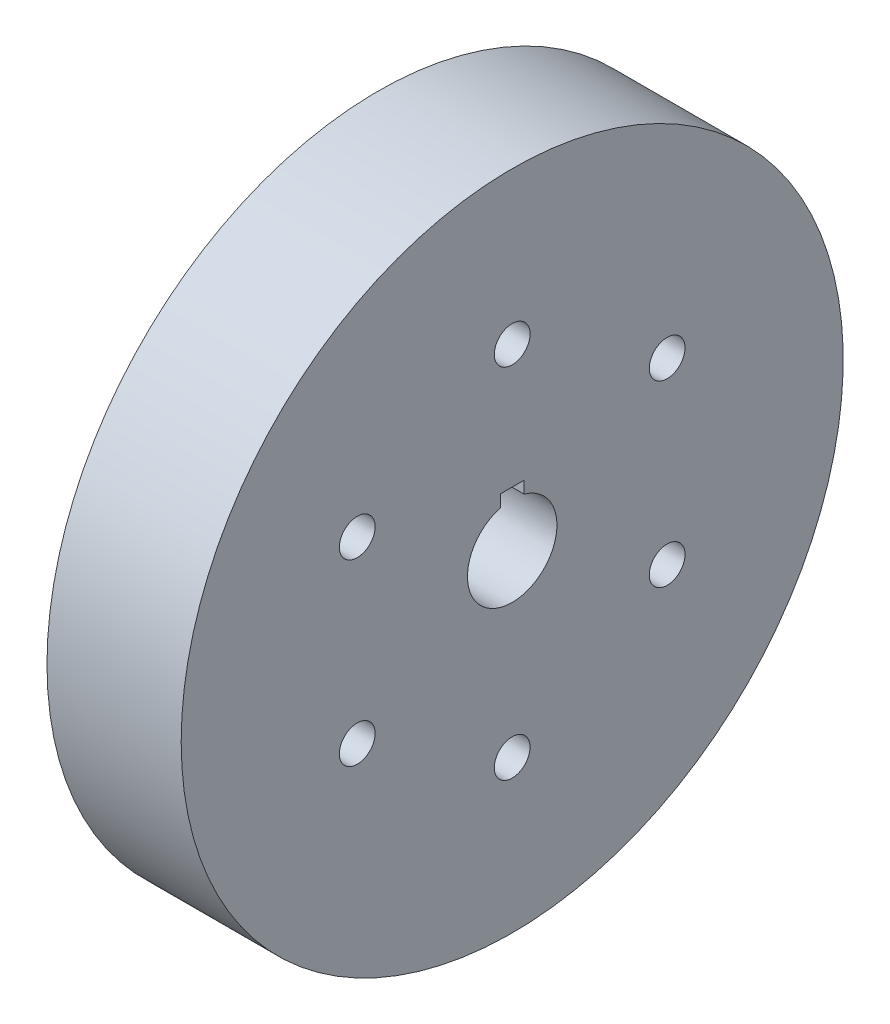
ISO-10303-21;
HEADER;
FILE_DESCRIPTION(('STEP AP214'),'2;1');
FILE_NAME('part.step','',(''),(''),'','','');
FILE_SCHEMA(('AUTOMOTIVE_DESIGN { 1 0 10303 214 1 1 1 1 }'));
ENDSEC;
DATA;
#1=APPLICATION_CONTEXT('core data for automotive mechanical design processes');
#2=APPLICATION_PROTOCOL_DEFINITION('international standard','automotive_design',2000,#1);
#3=PRODUCT_CONTEXT('',#1,'mechanical');
#4=PRODUCT('Part','Part','',(#3));
#5=PRODUCT_RELATED_PRODUCT_CATEGORY('part','',(#4));
#6=PRODUCT_DEFINITION_FORMATION('','',#4);
#7=PRODUCT_DEFINITION_CONTEXT('part definition',#1,'design');
#8=PRODUCT_DEFINITION('design','',#6,#7);
#9=PRODUCT_DEFINITION_SHAPE('','',#8);
#10=(LENGTH_UNIT() NAMED_UNIT(*) SI_UNIT(.MILLI.,.METRE.));
#11=(NAMED_UNIT(*) PLANE_ANGLE_UNIT() SI_UNIT($,.RADIAN.));
#12=(NAMED_UNIT(*) SI_UNIT($,.STERADIAN.) SOLID_ANGLE_UNIT());
#13=UNCERTAINTY_MEASURE_WITH_UNIT(LENGTH_MEASURE(1.E-05),#10,'distance_accuracy_value','');
#14=(GEOMETRIC_REPRESENTATION_CONTEXT(3) GLOBAL_UNCERTAINTY_ASSIGNED_CONTEXT((#13)) GLOBAL_UNIT_ASSIGNED_CONTEXT((#10,
#11,#12)) REPRESENTATION_CONTEXT('',''));
#15=CARTESIAN_POINT('',(0.,0.,0.));
#16=DIRECTION('',(0.,0.,1.));
#17=DIRECTION('',(1.,0.,0.));
#18=AXIS2_PLACEMENT_3D('',#15,#16,#17);
#19=CARTESIAN_POINT('',(0.,0.,0.));
#20=DIRECTION('',(-1.,0.,0.));
#21=DIRECTION('',(0.,0.,1.));
#22=AXIS2_PLACEMENT_3D('',#19,#20,#21);
#23=CYLINDRICAL_SURFACE('',#22,111.);
#24=CARTESIAN_POINT('',(-45.,0.,0.));
#25=DIRECTION('',(-1.,0.,0.));
#26=DIRECTION('',(0.,0.,1.));
#27=AXIS2_PLACEMENT_3D('',#24,#25,#26);
#28=CIRCLE('',#27,111.);
#29=CARTESIAN_POINT('',(-45.,0.,111.));
#30=VERTEX_POINT('',#29);
#31=EDGE_CURVE('E122',#30,#30,#28,.T.);
#32=ORIENTED_EDGE('',*,*,#31,.F.);
#33=EDGE_LOOP('',(#32));
#34=FACE_BOUND('',#33,.T.);
#35=CARTESIAN_POINT('',(0.,0.,0.));
#36=DIRECTION('',(-1.,0.,0.));
#37=DIRECTION('',(0.,0.,1.));
#38=AXIS2_PLACEMENT_3D('',#35,#36,#37);
#39=CIRCLE('',#38,111.);
#40=CARTESIAN_POINT('',(0.,0.,111.));
#41=VERTEX_POINT('',#40);
#42=EDGE_CURVE('E95',#41,#41,#39,.T.);
#43=ORIENTED_EDGE('',*,*,#42,.T.);
#44=EDGE_LOOP('',(#43));
#45=FACE_BOUND('',#44,.T.);
#46=ADVANCED_FACE('F36',(#34,#45),#23,.T.);
#47=CARTESIAN_POINT('',(-45.,0.,-111.));
#48=DIRECTION('',(1.,0.,0.));
#49=DIRECTION('',(0.,0.,-1.));
#50=AXIS2_PLACEMENT_3D('',#47,#48,#49);
#51=PLANE('',#50);
#52=CARTESIAN_POINT('',(-45.,0.,0.));
#53=DIRECTION('',(-1.,0.,0.));
#54=DIRECTION('',(0.,0.,1.));
#55=AXIS2_PLACEMENT_3D('',#52,#53,#54);
#56=CIRCLE('',#55,96.);
#57=CARTESIAN_POINT('',(-45.,0.,96.));
#58=VERTEX_POINT('',#57);
#59=EDGE_CURVE('E119',#58,#58,#56,.T.);
#60=ORIENTED_EDGE('',*,*,#59,.F.);
#61=EDGE_LOOP('',(#60));
#62=FACE_BOUND('',#61,.T.);
#63=ORIENTED_EDGE('',*,*,#31,.T.);
#64=EDGE_LOOP('',(#63));
#65=FACE_BOUND('',#64,.T.);
#66=ADVANCED_FACE('F149',(#62,#65),#51,.F.);
#67=CARTESIAN_POINT('',(0.,0.,0.));
#68=DIRECTION('',(-1.,0.,0.));
#69=DIRECTION('',(0.,0.,1.));
#70=AXIS2_PLACEMENT_3D('',#67,#68,#69);
#71=CYLINDRICAL_SURFACE('',#70,96.);
#72=CARTESIAN_POINT('',(-40.,0.,0.));
#73=DIRECTION('',(-1.,0.,0.));
#74=DIRECTION('',(0.,0.,1.));
#75=AXIS2_PLACEMENT_3D('',#72,#73,#74);
#76=CIRCLE('',#75,96.);
#77=CARTESIAN_POINT('',(-40.,0.,96.));
#78=VERTEX_POINT('',#77);
#79=EDGE_CURVE('E116',#78,#78,#76,.T.);
#80=ORIENTED_EDGE('',*,*,#79,.F.);
#81=EDGE_LOOP('',(#80));
#82=FACE_BOUND('',#81,.T.);
#83=ORIENTED_EDGE('',*,*,#59,.T.);
#84=EDGE_LOOP('',(#83));
#85=FACE_BOUND('',#84,.T.);
#86=ADVANCED_FACE('F154',(#82,#85),#71,.F.);
#87=CARTESIAN_POINT('',(-40.,0.,0.));
#88=DIRECTION('',(-1.,0.,0.));
#89=DIRECTION('',(0.,0.,1.));
#90=AXIS2_PLACEMENT_3D('',#87,#88,#89);
#91=TOROIDAL_SURFACE('',#90,91.,5.);
#92=CARTESIAN_POINT('',(-35.,0.,0.));
#93=DIRECTION('',(-1.,0.,0.));
#94=DIRECTION('',(0.,0.,1.));
#95=AXIS2_PLACEMENT_3D('',#92,#93,#94);
#96=CIRCLE('',#95,91.);
#97=CARTESIAN_POINT('',(-35.,0.,91.));
#98=VERTEX_POINT('',#97);
#99=EDGE_CURVE('E113',#98,#98,#96,.T.);
#100=ORIENTED_EDGE('',*,*,#99,.F.);
#101=EDGE_LOOP('',(#100));
#102=FACE_BOUND('',#101,.T.);
#103=ORIENTED_EDGE('',*,*,#79,.T.);
#104=EDGE_LOOP('',(#103));
#105=FACE_BOUND('',#104,.T.);
#106=ADVANCED_FACE('F164',(#102,#105),#91,.F.);
#107=CARTESIAN_POINT('',(-35.,0.,-91.));
#108=DIRECTION('',(1.,0.,0.));
#109=DIRECTION('',(0.,0.,-1.));
#110=AXIS2_PLACEMENT_3D('',#107,#108,#109);
#111=PLANE('',#110);
#112=CARTESIAN_POINT('',(-35.,-60.,0.));
#113=DIRECTION('',(-1.,0.,0.));
#114=DIRECTION('',(0.,0.,-1.));
#115=AXIS2_PLACEMENT_3D('',#112,#113,#114);
#116=CIRCLE('',#115,6.);
#117=CARTESIAN_POINT('',(-35.,-60.,-6.));
#118=VERTEX_POINT('',#117);
#119=EDGE_CURVE('E313',#118,#118,#116,.T.);
#120=ORIENTED_EDGE('',*,*,#119,.F.);
#121=EDGE_LOOP('',(#120));
#122=FACE_BOUND('',#121,.T.);
#123=CARTESIAN_POINT('',(-35.,29.9999999999994,-51.9615242270666));
#124=DIRECTION('',(-1.,0.,0.));
#125=DIRECTION('',(0.,0.,-1.));
#126=AXIS2_PLACEMENT_3D('',#123,#124,#125);
#127=CIRCLE('',#126,6.00000000000001);
#128=CARTESIAN_POINT('',(-35.,29.9999999999994,-57.9615242270666));
#129=VERTEX_POINT('',#128);
#130=EDGE_CURVE('E327',#129,#129,#127,.T.);
#131=ORIENTED_EDGE('',*,*,#130,.F.);
#132=EDGE_LOOP('',(#131));
#133=FACE_BOUND('',#132,.T.);
#134=CARTESIAN_POINT('',(-35.,-29.9999999999999,51.9615242270664));
#135=DIRECTION('',(-1.,0.,0.));
#136=DIRECTION('',(0.,0.,-1.));
#137=AXIS2_PLACEMENT_3D('',#134,#135,#136);
#138=CIRCLE('',#137,6.);
#139=CARTESIAN_POINT('',(-35.,-29.9999999999999,45.9615242270664));
#140=VERTEX_POINT('',#139);
#141=EDGE_CURVE('E338',#140,#140,#138,.T.);
#142=ORIENTED_EDGE('',*,*,#141,.F.);
#143=EDGE_LOOP('',(#142));
#144=FACE_BOUND('',#143,.T.);
#145=CARTESIAN_POINT('',(-35.,-29.9999999999994,-51.9615242270666));
#146=DIRECTION('',(-1.,0.,0.));
#147=DIRECTION('',(0.,0.,1.));
#148=AXIS2_PLACEMENT_3D('',#145,#146,#147);
#149=CIRCLE('',#148,6.00000000000001);
#150=CARTESIAN_POINT('',(-35.,-29.9999999999994,-45.9615242270666));
#151=VERTEX_POINT('',#150);
#152=EDGE_CURVE('E344',#151,#151,#149,.T.);
#153=ORIENTED_EDGE('',*,*,#152,.F.);
#154=EDGE_LOOP('',(#153));
#155=FACE_BOUND('',#154,.T.);
#156=CARTESIAN_POINT('',(-35.,60.,0.));
#157=DIRECTION('',(-1.,0.,0.));
#158=DIRECTION('',(0.,0.,1.));
#159=AXIS2_PLACEMENT_3D('',#156,#157,#158);
#160=CIRCLE('',#159,6.);
#161=CARTESIAN_POINT('',(-35.,60.,6.));
#162=VERTEX_POINT('',#161);
#163=EDGE_CURVE('E315',#162,#162,#160,.T.);
#164=ORIENTED_EDGE('',*,*,#163,.F.);
#165=EDGE_LOOP('',(#164));
#166=FACE_BOUND('',#165,.T.);
#167=CARTESIAN_POINT('',(-35.,29.9999999999999,51.9615242270664));
#168=DIRECTION('',(-1.,0.,0.));
#169=DIRECTION('',(0.,0.,1.));
#170=AXIS2_PLACEMENT_3D('',#167,#168,#169);
#171=CIRCLE('',#170,6.);
#172=CARTESIAN_POINT('',(-35.,29.9999999999999,57.9615242270664));
#173=VERTEX_POINT('',#172);
#174=EDGE_CURVE('E321',#173,#173,#171,.T.);
#175=ORIENTED_EDGE('',*,*,#174,.F.);
#176=EDGE_LOOP('',(#175));
#177=FACE_BOUND('',#176,.T.);
#178=CARTESIAN_POINT('',(-35.,0.,0.));
#179=DIRECTION('',(-1.,0.,0.));
#180=DIRECTION('',(0.,0.,1.));
#181=AXIS2_PLACEMENT_3D('',#178,#179,#180);
#182=CIRCLE('',#181,35.);
#183=CARTESIAN_POINT('',(-35.,0.,35.));
#184=VERTEX_POINT('',#183);
#185=EDGE_CURVE('E110',#184,#184,#182,.T.);
#186=ORIENTED_EDGE('',*,*,#185,.F.);
#187=EDGE_LOOP('',(#186));
#188=FACE_BOUND('',#187,.T.);
#189=ORIENTED_EDGE('',*,*,#99,.T.);
#190=EDGE_LOOP('',(#189));
#191=FACE_BOUND('',#190,.T.);
#192=ADVANCED_FACE('F171',(#122,#133,#144,#155,#166,#177,#188,#191),#111,.F.);
#193=CARTESIAN_POINT('',(-40.,0.,0.));
#194=DIRECTION('',(-1.,0.,0.));
#195=DIRECTION('',(0.,0.,1.));
#196=AXIS2_PLACEMENT_3D('',#193,#194,#195);
#197=TOROIDAL_SURFACE('',#196,35.,5.);
#198=CARTESIAN_POINT('',(-40.,0.,0.));
#199=DIRECTION('',(-1.,0.,0.));
#200=DIRECTION('',(0.,0.,1.));
#201=AXIS2_PLACEMENT_3D('',#198,#199,#200);
#202=CIRCLE('',#201,30.);
#203=CARTESIAN_POINT('',(-40.,0.,30.));
#204=VERTEX_POINT('',#203);
#205=EDGE_CURVE('E107',#204,#204,#202,.T.);
#206=ORIENTED_EDGE('',*,*,#205,.F.);
#207=EDGE_LOOP('',(#206));
#208=FACE_BOUND('',#207,.T.);
#209=ORIENTED_EDGE('',*,*,#185,.T.);
#210=EDGE_LOOP('',(#209));
#211=FACE_BOUND('',#210,.T.);
#212=ADVANCED_FACE('F175',(#208,#211),#197,.F.);
#213=CARTESIAN_POINT('',(0.,0.,0.));
#214=DIRECTION('',(-1.,0.,0.));
#215=DIRECTION('',(0.,0.,1.));
#216=AXIS2_PLACEMENT_3D('',#213,#214,#215);
#217=CYLINDRICAL_SURFACE('',#216,30.);
#218=CARTESIAN_POINT('',(-70.,0.,0.));
#219=DIRECTION('',(-1.,0.,0.));
#220=DIRECTION('',(0.,0.,1.));
#221=AXIS2_PLACEMENT_3D('',#218,#219,#220);
#222=CIRCLE('',#221,30.);
#223=CARTESIAN_POINT('',(-70.,0.,30.));
#224=VERTEX_POINT('',#223);
#225=EDGE_CURVE('E98',#224,#224,#222,.T.);
#226=ORIENTED_EDGE('',*,*,#225,.F.);
#227=EDGE_LOOP('',(#226));
#228=FACE_BOUND('',#227,.T.);
#229=ORIENTED_EDGE('',*,*,#205,.T.);
#230=EDGE_LOOP('',(#229));
#231=FACE_BOUND('',#230,.T.);
#232=ADVANCED_FACE('F146',(#228,#231),#217,.T.);
#233=CARTESIAN_POINT('',(-70.,0.,-30.));
#234=DIRECTION('',(1.,0.,0.));
#235=DIRECTION('',(0.,0.,-1.));
#236=AXIS2_PLACEMENT_3D('',#233,#234,#235);
#237=PLANE('',#236);
#238=DIRECTION('',(0.,0.,1.));
#239=VECTOR('',#238,1.);
#240=CARTESIAN_POINT('',(-70.,18.5,-3.99999999999999));
#241=LINE('',#240,#239);
#242=CARTESIAN_POINT('',(-70.,18.5,-3.99999999999999));
#243=VERTEX_POINT('',#242);
#244=CARTESIAN_POINT('',(-70.,18.5,4.00000000000001));
#245=VERTEX_POINT('',#244);
#246=EDGE_CURVE('E127',#243,#245,#241,.T.);
#247=ORIENTED_EDGE('',*,*,#246,.T.);
#248=DIRECTION('',(0.,1.,0.));
#249=VECTOR('',#248,1.);
#250=CARTESIAN_POINT('',(-70.,11.5,4.00000000000001));
#251=LINE('',#250,#249);
#252=CARTESIAN_POINT('',(-70.,14.456832294801,4.00000000000001));
#253=VERTEX_POINT('',#252);
#254=EDGE_CURVE('E87',#253,#245,#251,.T.);
#255=ORIENTED_EDGE('',*,*,#254,.F.);
#256=CARTESIAN_POINT('',(-70.,0.,0.));
#257=DIRECTION('',(-1.,0.,0.));
#258=DIRECTION('',(0.,0.,1.));
#259=AXIS2_PLACEMENT_3D('',#256,#257,#258);
#260=CIRCLE('',#259,15.);
#261=CARTESIAN_POINT('',(-70.,14.456832294801,-3.99999999999999));
#262=VERTEX_POINT('',#261);
#263=EDGE_CURVE('E94',#262,#253,#260,.T.);
#264=ORIENTED_EDGE('',*,*,#263,.F.);
#265=DIRECTION('',(0.,1.,0.));
#266=VECTOR('',#265,1.);
#267=CARTESIAN_POINT('',(-70.,11.5,-3.99999999999999));
#268=LINE('',#267,#266);
#269=EDGE_CURVE('E83',#262,#243,#268,.T.);
#270=ORIENTED_EDGE('',*,*,#269,.T.);
#271=EDGE_LOOP('',(#247,#255,#264,#270));
#272=FACE_BOUND('',#271,.T.);
#273=ORIENTED_EDGE('',*,*,#225,.T.);
#274=EDGE_LOOP('',(#273));
#275=FACE_BOUND('',#274,.T.);
#276=ADVANCED_FACE('F132',(#272,#275),#237,.F.);
#277=CARTESIAN_POINT('',(0.,0.,0.));
#278=DIRECTION('',(-1.,0.,0.));
#279=DIRECTION('',(0.,0.,1.));
#280=AXIS2_PLACEMENT_3D('',#277,#278,#279);
#281=CYLINDRICAL_SURFACE('',#280,15.);
#282=ORIENTED_EDGE('',*,*,#263,.T.);
#283=DIRECTION('',(-1.,0.,0.));
#284=VECTOR('',#283,1.);
#285=CARTESIAN_POINT('',(0.,14.456832294801,4.00000000000001));
#286=LINE('',#285,#284);
#287=CARTESIAN_POINT('',(0.,14.456832294801,4.00000000000001));
#288=VERTEX_POINT('',#287);
#289=EDGE_CURVE('E101',#253,#288,#286,.F.);
#290=ORIENTED_EDGE('',*,*,#289,.T.);
#291=CARTESIAN_POINT('',(0.,0.,0.));
#292=DIRECTION('',(-1.,0.,0.));
#293=DIRECTION('',(0.,0.,1.));
#294=AXIS2_PLACEMENT_3D('',#291,#292,#293);
#295=CIRCLE('',#294,15.);
#296=CARTESIAN_POINT('',(0.,14.456832294801,-3.99999999999999));
#297=VERTEX_POINT('',#296);
#298=EDGE_CURVE('E92',#297,#288,#295,.T.);
#299=ORIENTED_EDGE('',*,*,#298,.F.);
#300=DIRECTION('',(-1.,0.,0.));
#301=VECTOR('',#300,1.);
#302=CARTESIAN_POINT('',(0.,14.456832294801,-3.99999999999999));
#303=LINE('',#302,#301);
#304=EDGE_CURVE('E50',#262,#297,#303,.F.);
#305=ORIENTED_EDGE('',*,*,#304,.F.);
#306=EDGE_LOOP('',(#282,#290,#299,#305));
#307=FACE_BOUND('',#306,.T.);
#308=ADVANCED_FACE('F137',(#307),#281,.F.);
#309=CARTESIAN_POINT('',(0.,0.,-15.));
#310=DIRECTION('',(-1.,0.,0.));
#311=DIRECTION('',(0.,0.,1.));
#312=AXIS2_PLACEMENT_3D('',#309,#310,#311);
#313=PLANE('',#312);
#314=CARTESIAN_POINT('',(0.,-60.,0.));
#315=DIRECTION('',(-1.,0.,0.));
#316=DIRECTION('',(0.,0.,-1.));
#317=AXIS2_PLACEMENT_3D('',#314,#315,#316);
#318=CIRCLE('',#317,6.);
#319=CARTESIAN_POINT('',(0.,-60.,-6.));
#320=VERTEX_POINT('',#319);
#321=EDGE_CURVE('E310',#320,#320,#318,.T.);
#322=ORIENTED_EDGE('',*,*,#321,.T.);
#323=EDGE_LOOP('',(#322));
#324=FACE_BOUND('',#323,.T.);
#325=CARTESIAN_POINT('',(0.,29.9999999999994,-51.9615242270666));
#326=DIRECTION('',(-1.,0.,0.));
#327=DIRECTION('',(0.,0.,-1.));
#328=AXIS2_PLACEMENT_3D('',#325,#326,#327);
#329=CIRCLE('',#328,6.00000000000001);
#330=CARTESIAN_POINT('',(0.,29.9999999999994,-57.9615242270666));
#331=VERTEX_POINT('',#330);
#332=EDGE_CURVE('E323',#331,#331,#329,.T.);
#333=ORIENTED_EDGE('',*,*,#332,.T.);
#334=EDGE_LOOP('',(#333));
#335=FACE_BOUND('',#334,.T.);
#336=CARTESIAN_POINT('',(0.,-29.9999999999999,51.9615242270664));
#337=DIRECTION('',(-1.,0.,0.));
#338=DIRECTION('',(0.,0.,-1.));
#339=AXIS2_PLACEMENT_3D('',#336,#337,#338);
#340=CIRCLE('',#339,6.);
#341=CARTESIAN_POINT('',(0.,-29.9999999999999,45.9615242270664));
#342=VERTEX_POINT('',#341);
#343=EDGE_CURVE('E332',#342,#342,#340,.T.);
#344=ORIENTED_EDGE('',*,*,#343,.T.);
#345=EDGE_LOOP('',(#344));
#346=FACE_BOUND('',#345,.T.);
#347=CARTESIAN_POINT('',(0.,-29.9999999999994,-51.9615242270666));
#348=DIRECTION('',(-1.,0.,0.));
#349=DIRECTION('',(0.,0.,1.));
#350=AXIS2_PLACEMENT_3D('',#347,#348,#349);
#351=CIRCLE('',#350,6.00000000000001);
#352=CARTESIAN_POINT('',(0.,-29.9999999999994,-45.9615242270666));
#353=VERTEX_POINT('',#352);
#354=EDGE_CURVE('E340',#353,#353,#351,.T.);
#355=ORIENTED_EDGE('',*,*,#354,.T.);
#356=EDGE_LOOP('',(#355));
#357=FACE_BOUND('',#356,.T.);
#358=CARTESIAN_POINT('',(0.,60.,0.));
#359=DIRECTION('',(-1.,0.,0.));
#360=DIRECTION('',(0.,0.,1.));
#361=AXIS2_PLACEMENT_3D('',#358,#359,#360);
#362=CIRCLE('',#361,6.);
#363=CARTESIAN_POINT('',(0.,60.,6.));
#364=VERTEX_POINT('',#363);
#365=EDGE_CURVE('E349',#364,#364,#362,.T.);
#366=ORIENTED_EDGE('',*,*,#365,.T.);
#367=EDGE_LOOP('',(#366));
#368=FACE_BOUND('',#367,.T.);
#369=CARTESIAN_POINT('',(0.,29.9999999999999,51.9615242270664));
#370=DIRECTION('',(-1.,0.,0.));
#371=DIRECTION('',(0.,0.,1.));
#372=AXIS2_PLACEMENT_3D('',#369,#370,#371);
#373=CIRCLE('',#372,6.);
#374=CARTESIAN_POINT('',(0.,29.9999999999999,57.9615242270664));
#375=VERTEX_POINT('',#374);
#376=EDGE_CURVE('E129',#375,#375,#373,.T.);
#377=ORIENTED_EDGE('',*,*,#376,.T.);
#378=EDGE_LOOP('',(#377));
#379=FACE_BOUND('',#378,.T.);
#380=ORIENTED_EDGE('',*,*,#42,.F.);
#381=EDGE_LOOP('',(#380));
#382=FACE_BOUND('',#381,.T.);
#383=ORIENTED_EDGE('',*,*,#298,.T.);
#384=DIRECTION('',(0.,1.,0.));
#385=VECTOR('',#384,1.);
#386=CARTESIAN_POINT('',(0.,0.,4.00000000000001));
#387=LINE('',#386,#385);
#388=CARTESIAN_POINT('',(0.,18.5,4.00000000000001));
#389=VERTEX_POINT('',#388);
#390=EDGE_CURVE('E11',#288,#389,#387,.T.);
#391=ORIENTED_EDGE('',*,*,#390,.T.);
#392=DIRECTION('',(0.,0.,1.));
#393=VECTOR('',#392,1.);
#394=CARTESIAN_POINT('',(0.,18.5,-3.99999999999999));
#395=LINE('',#394,#393);
#396=CARTESIAN_POINT('',(0.,18.5,-3.99999999999999));
#397=VERTEX_POINT('',#396);
#398=EDGE_CURVE('E76',#397,#389,#395,.T.);
#399=ORIENTED_EDGE('',*,*,#398,.F.);
#400=DIRECTION('',(0.,1.,0.));
#401=VECTOR('',#400,1.);
#402=CARTESIAN_POINT('',(0.,0.,-3.99999999999999));
#403=LINE('',#402,#401);
#404=EDGE_CURVE('E43',#297,#397,#403,.T.);
#405=ORIENTED_EDGE('',*,*,#404,.F.);
#406=EDGE_LOOP('',(#383,#391,#399,#405));
#407=FACE_BOUND('',#406,.T.);
#408=ADVANCED_FACE('F90',(#324,#335,#346,#357,#368,#379,#382,#407),#313,.F.);
#409=CARTESIAN_POINT('',(0.,11.5,4.00000000000001));
#410=DIRECTION('',(0.,0.,1.));
#411=DIRECTION('',(1.,0.,0.));
#412=AXIS2_PLACEMENT_3D('',#409,#410,#411);
#413=PLANE('',#412);
#414=ORIENTED_EDGE('',*,*,#254,.T.);
#415=DIRECTION('',(-1.,0.,0.));
#416=VECTOR('',#415,1.);
#417=CARTESIAN_POINT('',(0.,18.5,4.00000000000001));
#418=LINE('',#417,#416);
#419=EDGE_CURVE('E79',#389,#245,#418,.T.);
#420=ORIENTED_EDGE('',*,*,#419,.F.);
#421=ORIENTED_EDGE('',*,*,#390,.F.);
#422=ORIENTED_EDGE('',*,*,#289,.F.);
#423=EDGE_LOOP('',(#414,#420,#421,#422));
#424=FACE_BOUND('',#423,.T.);
#425=ADVANCED_FACE('F85',(#424),#413,.F.);
#426=CARTESIAN_POINT('',(0.,11.5,-3.99999999999999));
#427=DIRECTION('',(0.,0.,1.));
#428=DIRECTION('',(1.,0.,0.));
#429=AXIS2_PLACEMENT_3D('',#426,#427,#428);
#430=PLANE('',#429);
#431=ORIENTED_EDGE('',*,*,#304,.T.);
#432=ORIENTED_EDGE('',*,*,#404,.T.);
#433=DIRECTION('',(-1.,0.,0.));
#434=VECTOR('',#433,1.);
#435=CARTESIAN_POINT('',(0.,18.5,-3.99999999999999));
#436=LINE('',#435,#434);
#437=EDGE_CURVE('E81',#397,#243,#436,.T.);
#438=ORIENTED_EDGE('',*,*,#437,.T.);
#439=ORIENTED_EDGE('',*,*,#269,.F.);
#440=EDGE_LOOP('',(#431,#432,#438,#439));
#441=FACE_BOUND('',#440,.T.);
#442=ADVANCED_FACE('F124',(#441),#430,.T.);
#443=CARTESIAN_POINT('',(0.,18.5,-3.99999999999999));
#444=DIRECTION('',(0.,-1.,0.));
#445=DIRECTION('',(0.,0.,-1.));
#446=AXIS2_PLACEMENT_3D('',#443,#444,#445);
#447=PLANE('',#446);
#448=ORIENTED_EDGE('',*,*,#246,.F.);
#449=ORIENTED_EDGE('',*,*,#437,.F.);
#450=ORIENTED_EDGE('',*,*,#398,.T.);
#451=ORIENTED_EDGE('',*,*,#419,.T.);
#452=EDGE_LOOP('',(#448,#449,#450,#451));
#453=FACE_BOUND('',#452,.T.);
#454=ADVANCED_FACE('F78',(#453),#447,.T.);
#455=CARTESIAN_POINT('',(0.,29.9999999999999,51.9615242270664));
#456=DIRECTION('',(-1.,0.,0.));
#457=DIRECTION('',(0.,0.,1.));
#458=AXIS2_PLACEMENT_3D('',#455,#456,#457);
#459=CYLINDRICAL_SURFACE('',#458,6.);
#460=ORIENTED_EDGE('',*,*,#376,.F.);
#461=EDGE_LOOP('',(#460));
#462=FACE_BOUND('',#461,.T.);
#463=ORIENTED_EDGE('',*,*,#174,.T.);
#464=EDGE_LOOP('',(#463));
#465=FACE_BOUND('',#464,.T.);
#466=ADVANCED_FACE('F231',(#462,#465),#459,.F.);
#467=CARTESIAN_POINT('',(0.,60.,0.));
#468=DIRECTION('',(-1.,0.,0.));
#469=DIRECTION('',(0.,0.,1.));
#470=AXIS2_PLACEMENT_3D('',#467,#468,#469);
#471=CYLINDRICAL_SURFACE('',#470,6.);
#472=ORIENTED_EDGE('',*,*,#365,.F.);
#473=EDGE_LOOP('',(#472));
#474=FACE_BOUND('',#473,.T.);
#475=ORIENTED_EDGE('',*,*,#163,.T.);
#476=EDGE_LOOP('',(#475));
#477=FACE_BOUND('',#476,.T.);
#478=ADVANCED_FACE('F253',(#474,#477),#471,.F.);
#479=CARTESIAN_POINT('',(0.,-29.9999999999994,-51.9615242270666));
#480=DIRECTION('',(-1.,0.,0.));
#481=DIRECTION('',(0.,0.,1.));
#482=AXIS2_PLACEMENT_3D('',#479,#480,#481);
#483=CYLINDRICAL_SURFACE('',#482,6.00000000000001);
#484=ORIENTED_EDGE('',*,*,#354,.F.);
#485=EDGE_LOOP('',(#484));
#486=FACE_BOUND('',#485,.T.);
#487=ORIENTED_EDGE('',*,*,#152,.T.);
#488=EDGE_LOOP('',(#487));
#489=FACE_BOUND('',#488,.T.);
#490=ADVANCED_FACE('F263',(#486,#489),#483,.F.);
#491=CARTESIAN_POINT('',(0.,-29.9999999999999,51.9615242270664));
#492=DIRECTION('',(-1.,0.,0.));
#493=DIRECTION('',(0.,0.,1.));
#494=AXIS2_PLACEMENT_3D('',#491,#492,#493);
#495=CYLINDRICAL_SURFACE('',#494,6.);
#496=ORIENTED_EDGE('',*,*,#343,.F.);
#497=EDGE_LOOP('',(#496));
#498=FACE_BOUND('',#497,.T.);
#499=ORIENTED_EDGE('',*,*,#141,.T.);
#500=EDGE_LOOP('',(#499));
#501=FACE_BOUND('',#500,.T.);
#502=ADVANCED_FACE('F273',(#498,#501),#495,.F.);
#503=CARTESIAN_POINT('',(0.,29.9999999999994,-51.9615242270666));
#504=DIRECTION('',(-1.,0.,0.));
#505=DIRECTION('',(0.,0.,1.));
#506=AXIS2_PLACEMENT_3D('',#503,#504,#505);
#507=CYLINDRICAL_SURFACE('',#506,6.00000000000001);
#508=ORIENTED_EDGE('',*,*,#332,.F.);
#509=EDGE_LOOP('',(#508));
#510=FACE_BOUND('',#509,.T.);
#511=ORIENTED_EDGE('',*,*,#130,.T.);
#512=EDGE_LOOP('',(#511));
#513=FACE_BOUND('',#512,.T.);
#514=ADVANCED_FACE('F283',(#510,#513),#507,.F.);
#515=CARTESIAN_POINT('',(0.,-60.,0.));
#516=DIRECTION('',(-1.,0.,0.));
#517=DIRECTION('',(0.,0.,1.));
#518=AXIS2_PLACEMENT_3D('',#515,#516,#517);
#519=CYLINDRICAL_SURFACE('',#518,6.);
#520=ORIENTED_EDGE('',*,*,#321,.F.);
#521=EDGE_LOOP('',(#520));
#522=FACE_BOUND('',#521,.T.);
#523=ORIENTED_EDGE('',*,*,#119,.T.);
#524=EDGE_LOOP('',(#523));
#525=FACE_BOUND('',#524,.T.);
#526=ADVANCED_FACE('F293',(#522,#525),#519,.F.);
#527=CLOSED_SHELL('',(#46,#66,#86,#106,#192,#212,#232,#276,#308,#408,#425,#442,#454,#466,#478,
#490,#502,#514,#526));
#528=MANIFOLD_SOLID_BREP('B2',#527);
#529=ADVANCED_BREP_SHAPE_REPRESENTATION('',(#18,#528),#14);
#530=SHAPE_DEFINITION_REPRESENTATION(#9,#529);
ENDSEC;
END-ISO-10303-21;
